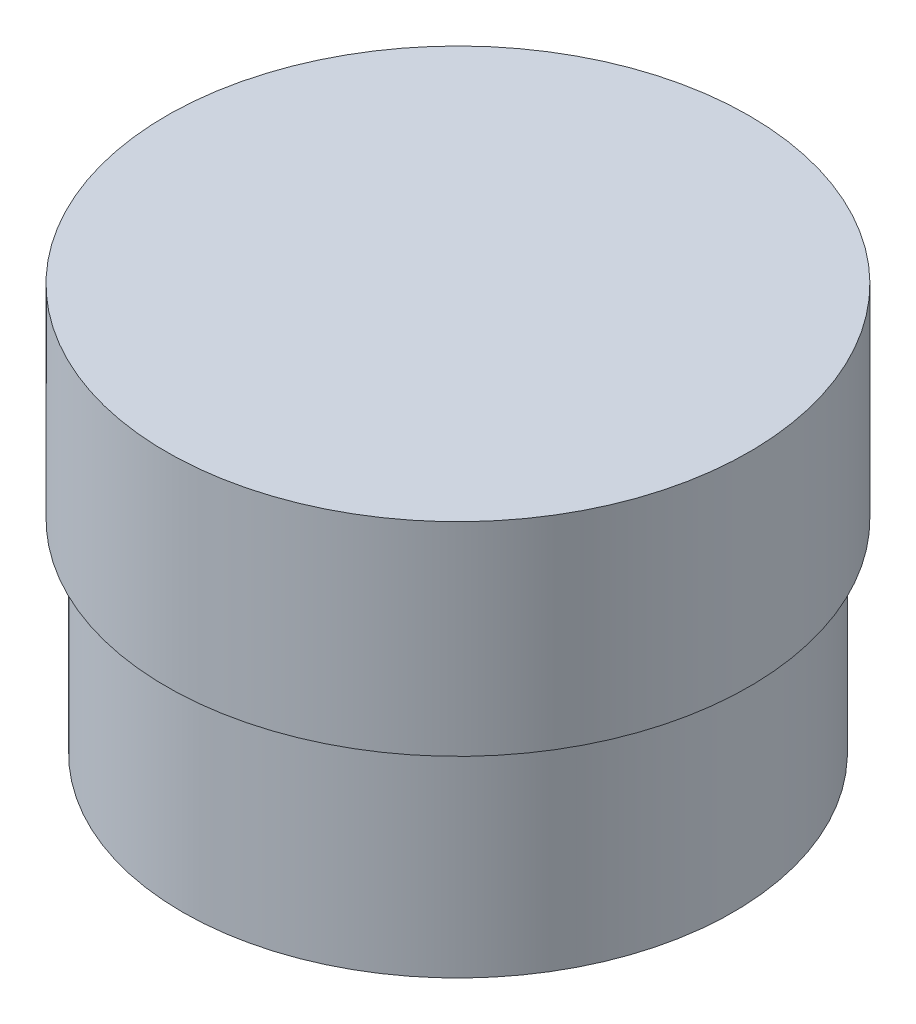
ISO-10303-21;
HEADER;
FILE_DESCRIPTION(('STEP AP214'),'2;1');
FILE_NAME('part.step','',(''),(''),'','','');
FILE_SCHEMA(('AUTOMOTIVE_DESIGN { 1 0 10303 214 1 1 1 1 }'));
ENDSEC;
DATA;
#1=APPLICATION_CONTEXT('core data for automotive mechanical design processes');
#2=APPLICATION_PROTOCOL_DEFINITION('international standard','automotive_design',2000,#1);
#3=PRODUCT_CONTEXT('',#1,'mechanical');
#4=PRODUCT('Part','Part','',(#3));
#5=PRODUCT_RELATED_PRODUCT_CATEGORY('part','',(#4));
#6=PRODUCT_DEFINITION_FORMATION('','',#4);
#7=PRODUCT_DEFINITION_CONTEXT('part definition',#1,'design');
#8=PRODUCT_DEFINITION('design','',#6,#7);
#9=PRODUCT_DEFINITION_SHAPE('','',#8);
#10=(LENGTH_UNIT() NAMED_UNIT(*) SI_UNIT(.MILLI.,.METRE.));
#11=(NAMED_UNIT(*) PLANE_ANGLE_UNIT() SI_UNIT($,.RADIAN.));
#12=(NAMED_UNIT(*) SI_UNIT($,.STERADIAN.) SOLID_ANGLE_UNIT());
#13=UNCERTAINTY_MEASURE_WITH_UNIT(LENGTH_MEASURE(1.E-05),#10,'distance_accuracy_value','');
#14=(GEOMETRIC_REPRESENTATION_CONTEXT(3) GLOBAL_UNCERTAINTY_ASSIGNED_CONTEXT((#13)) GLOBAL_UNIT_ASSIGNED_CONTEXT((#10,
#11,#12)) REPRESENTATION_CONTEXT('',''));
#15=CARTESIAN_POINT('',(0.,0.,0.));
#16=DIRECTION('',(0.,0.,1.));
#17=DIRECTION('',(1.,0.,0.));
#18=AXIS2_PLACEMENT_3D('',#15,#16,#17);
#19=CARTESIAN_POINT('',(0.,21.,0.));
#20=DIRECTION('',(0.,-1.,0.));
#21=DIRECTION('',(0.,0.,-1.));
#22=AXIS2_PLACEMENT_3D('',#19,#20,#21);
#23=CYLINDRICAL_SURFACE('',#22,30.1);
#24=CARTESIAN_POINT('',(0.,21.,0.));
#25=DIRECTION('',(0.,1.,0.));
#26=DIRECTION('',(0.,0.,1.));
#27=AXIS2_PLACEMENT_3D('',#24,#25,#26);
#28=CIRCLE('',#27,30.1);
#29=CARTESIAN_POINT('',(0.,21.,-30.1));
#30=VERTEX_POINT('',#29);
#31=EDGE_CURVE('E10',#30,#30,#28,.T.);
#32=CARTESIAN_POINT('',(0.,0.,0.));
#33=DIRECTION('',(0.,1.,0.));
#34=DIRECTION('',(0.,0.,1.));
#35=AXIS2_PLACEMENT_3D('',#32,#33,#34);
#36=CIRCLE('',#35,30.1);
#37=CARTESIAN_POINT('',(0.,0.,-30.1));
#38=VERTEX_POINT('',#37);
#39=EDGE_CURVE('E44',#38,#38,#36,.T.);
#40=CARTESIAN_POINT('',(0.,21.,-30.1));
#41=CARTESIAN_POINT('',(0.,20.78125,-30.1));
#42=CARTESIAN_POINT('',(0.,20.5625,-30.1));
#43=CARTESIAN_POINT('',(0.,20.125,-30.1));
#44=CARTESIAN_POINT('',(0.,19.90625,-30.1));
#45=CARTESIAN_POINT('',(0.,19.46875,-30.1));
#46=CARTESIAN_POINT('',(0.,19.25,-30.1));
#47=CARTESIAN_POINT('',(0.,18.8125,-30.1));
#48=CARTESIAN_POINT('',(0.,18.59375,-30.1));
#49=CARTESIAN_POINT('',(0.,18.15625,-30.1));
#50=CARTESIAN_POINT('',(0.,17.9375,-30.1));
#51=CARTESIAN_POINT('',(0.,17.5,-30.1));
#52=CARTESIAN_POINT('',(0.,17.28125,-30.1));
#53=CARTESIAN_POINT('',(0.,16.84375,-30.1));
#54=CARTESIAN_POINT('',(0.,16.625,-30.1));
#55=CARTESIAN_POINT('',(0.,16.1875,-30.1));
#56=CARTESIAN_POINT('',(0.,15.96875,-30.1));
#57=CARTESIAN_POINT('',(0.,15.53125,-30.1));
#58=CARTESIAN_POINT('',(0.,15.3125,-30.1));
#59=CARTESIAN_POINT('',(0.,14.875,-30.1));
#60=CARTESIAN_POINT('',(0.,14.65625,-30.1));
#61=CARTESIAN_POINT('',(0.,14.21875,-30.1));
#62=CARTESIAN_POINT('',(0.,14.,-30.1));
#63=CARTESIAN_POINT('',(0.,13.5625,-30.1));
#64=CARTESIAN_POINT('',(0.,13.34375,-30.1));
#65=CARTESIAN_POINT('',(0.,12.90625,-30.1));
#66=CARTESIAN_POINT('',(0.,12.6875,-30.1));
#67=CARTESIAN_POINT('',(0.,12.25,-30.1));
#68=CARTESIAN_POINT('',(0.,12.03125,-30.1));
#69=CARTESIAN_POINT('',(0.,11.59375,-30.1));
#70=CARTESIAN_POINT('',(0.,11.375,-30.1));
#71=CARTESIAN_POINT('',(0.,10.9375,-30.1));
#72=CARTESIAN_POINT('',(0.,10.71875,-30.1));
#73=CARTESIAN_POINT('',(0.,10.28125,-30.1));
#74=CARTESIAN_POINT('',(0.,10.0625,-30.1));
#75=CARTESIAN_POINT('',(0.,9.625,-30.1));
#76=CARTESIAN_POINT('',(0.,9.40625,-30.1));
#77=CARTESIAN_POINT('',(0.,8.96875,-30.1));
#78=CARTESIAN_POINT('',(0.,8.75,-30.1));
#79=CARTESIAN_POINT('',(0.,8.3125,-30.1));
#80=CARTESIAN_POINT('',(0.,8.09375,-30.1));
#81=CARTESIAN_POINT('',(0.,7.65625,-30.1));
#82=CARTESIAN_POINT('',(0.,7.4375,-30.1));
#83=CARTESIAN_POINT('',(0.,7.,-30.1));
#84=CARTESIAN_POINT('',(0.,6.78125,-30.1));
#85=CARTESIAN_POINT('',(0.,6.34375,-30.1));
#86=CARTESIAN_POINT('',(0.,6.125,-30.1));
#87=CARTESIAN_POINT('',(0.,5.6875,-30.1));
#88=CARTESIAN_POINT('',(0.,5.46875,-30.1));
#89=CARTESIAN_POINT('',(0.,5.03125,-30.1));
#90=CARTESIAN_POINT('',(0.,4.8125,-30.1));
#91=CARTESIAN_POINT('',(0.,4.375,-30.1));
#92=CARTESIAN_POINT('',(0.,4.15625,-30.1));
#93=CARTESIAN_POINT('',(0.,3.71875,-30.1));
#94=CARTESIAN_POINT('',(0.,3.5,-30.1));
#95=CARTESIAN_POINT('',(0.,3.0625,-30.1));
#96=CARTESIAN_POINT('',(0.,2.84375,-30.1));
#97=CARTESIAN_POINT('',(0.,2.40625,-30.1));
#98=CARTESIAN_POINT('',(0.,2.1875,-30.1));
#99=CARTESIAN_POINT('',(0.,1.75,-30.1));
#100=CARTESIAN_POINT('',(0.,1.53125,-30.1));
#101=CARTESIAN_POINT('',(0.,1.09375,-30.1));
#102=CARTESIAN_POINT('',(0.,0.875000000000001,-30.1));
#103=CARTESIAN_POINT('',(0.,0.4375,-30.1));
#104=CARTESIAN_POINT('',(0.,0.21875,-30.1));
#105=CARTESIAN_POINT('',(0.,0.,-30.1));
#106=B_SPLINE_CURVE_WITH_KNOTS('',3,(#40,#41,#42,#43,#44,#45,#46,#47,#48,#49,#50,#51,#52,#53,
#54,#55,#56,#57,#58,#59,#60,#61,#62,#63,#64,#65,#66,#67,#68,#69,#70,#71,#72,#73,#74,#75,#76,#77,
#78,#79,#80,#81,#82,#83,#84,#85,#86,#87,#88,#89,#90,#91,#92,#93,#94,#95,#96,#97,#98,#99,#100,
#101,#102,#103,#104,#105),.UNSPECIFIED.,.F.,.F.,(4,2,2,2,2,2,2,2,2,2,2,2,2,2,2,2,2,2,2,2,2,2,2,
2,2,2,2,2,2,2,2,2,4),(0.,0.656250000000001,1.3125,1.96875,2.625,3.28125,3.9375,4.59375,5.25,
5.90625,6.5625,7.21875,7.875,8.53125,9.1875,9.84375,10.5,11.15625,11.8125,12.46875,13.125,
13.78125,14.4375,15.09375,15.75,16.40625,17.0625,17.71875,18.375,19.03125,19.6875,20.34375,21.),.UNSPECIFIED.);
#107=EDGE_CURVE('BSEAM41',#30,#38,#106,.T.);
#108=ORIENTED_EDGE('',*,*,#31,.F.);
#109=ORIENTED_EDGE('',*,*,#39,.T.);
#110=ORIENTED_EDGE('',*,*,#107,.T.);
#111=ORIENTED_EDGE('',*,*,#107,.F.);
#112=EDGE_LOOP('',(#108,#110,#109,#111));
#113=FACE_BOUND('',#112,.T.);
#114=ADVANCED_FACE('F41',(#113),#23,.T.);
#115=CARTESIAN_POINT('',(0.,21.,0.));
#116=DIRECTION('',(0.,1.,0.));
#117=DIRECTION('',(0.,0.,1.));
#118=AXIS2_PLACEMENT_3D('',#115,#116,#117);
#119=PLANE('',#118);
#120=ORIENTED_EDGE('',*,*,#31,.T.);
#121=EDGE_LOOP('',(#120));
#122=FACE_BOUND('',#121,.T.);
#123=ADVANCED_FACE('F96',(#122),#119,.T.);
#124=CARTESIAN_POINT('',(0.,0.,0.));
#125=DIRECTION('',(0.,1.,0.));
#126=DIRECTION('',(0.,0.,1.));
#127=AXIS2_PLACEMENT_3D('',#124,#125,#126);
#128=PLANE('',#127);
#129=CARTESIAN_POINT('',(0.,0.,0.));
#130=DIRECTION('',(0.,1.,0.));
#131=DIRECTION('',(0.,0.,1.));
#132=AXIS2_PLACEMENT_3D('',#129,#130,#131);
#133=CIRCLE('',#132,28.45);
#134=CARTESIAN_POINT('',(0.,0.,28.45));
#135=VERTEX_POINT('',#134);
#136=EDGE_CURVE('E55',#135,#135,#133,.T.);
#137=ORIENTED_EDGE('',*,*,#136,.T.);
#138=EDGE_LOOP('',(#137));
#139=FACE_BOUND('',#138,.T.);
#140=ORIENTED_EDGE('',*,*,#39,.F.);
#141=EDGE_LOOP('',(#140));
#142=FACE_BOUND('',#141,.T.);
#143=ADVANCED_FACE('F101',(#139,#142),#128,.F.);
#144=CARTESIAN_POINT('',(0.,-21.,0.));
#145=DIRECTION('',(0.,1.,0.));
#146=DIRECTION('',(0.,0.,1.));
#147=AXIS2_PLACEMENT_3D('',#144,#145,#146);
#148=CYLINDRICAL_SURFACE('',#147,28.45);
#149=CARTESIAN_POINT('',(0.,-21.,0.));
#150=DIRECTION('',(0.,1.,0.));
#151=DIRECTION('',(0.,0.,1.));
#152=AXIS2_PLACEMENT_3D('',#149,#150,#151);
#153=CIRCLE('',#152,28.45);
#154=CARTESIAN_POINT('',(0.,-21.,28.45));
#155=VERTEX_POINT('',#154);
#156=EDGE_CURVE('E53',#155,#155,#153,.T.);
#157=CARTESIAN_POINT('',(0.,-21.,28.45));
#158=CARTESIAN_POINT('',(0.,-20.78125,28.45));
#159=CARTESIAN_POINT('',(0.,-20.5625,28.45));
#160=CARTESIAN_POINT('',(0.,-20.125,28.45));
#161=CARTESIAN_POINT('',(0.,-19.90625,28.45));
#162=CARTESIAN_POINT('',(0.,-19.46875,28.45));
#163=CARTESIAN_POINT('',(0.,-19.25,28.45));
#164=CARTESIAN_POINT('',(0.,-18.8125,28.45));
#165=CARTESIAN_POINT('',(0.,-18.59375,28.45));
#166=CARTESIAN_POINT('',(0.,-18.15625,28.45));
#167=CARTESIAN_POINT('',(0.,-17.9375,28.45));
#168=CARTESIAN_POINT('',(0.,-17.5,28.45));
#169=CARTESIAN_POINT('',(0.,-17.28125,28.45));
#170=CARTESIAN_POINT('',(0.,-16.84375,28.45));
#171=CARTESIAN_POINT('',(0.,-16.625,28.45));
#172=CARTESIAN_POINT('',(0.,-16.1875,28.45));
#173=CARTESIAN_POINT('',(0.,-15.96875,28.45));
#174=CARTESIAN_POINT('',(0.,-15.53125,28.45));
#175=CARTESIAN_POINT('',(0.,-15.3125,28.45));
#176=CARTESIAN_POINT('',(0.,-14.875,28.45));
#177=CARTESIAN_POINT('',(0.,-14.65625,28.45));
#178=CARTESIAN_POINT('',(0.,-14.21875,28.45));
#179=CARTESIAN_POINT('',(0.,-14.,28.45));
#180=CARTESIAN_POINT('',(0.,-13.5625,28.45));
#181=CARTESIAN_POINT('',(0.,-13.34375,28.45));
#182=CARTESIAN_POINT('',(0.,-12.90625,28.45));
#183=CARTESIAN_POINT('',(0.,-12.6875,28.45));
#184=CARTESIAN_POINT('',(0.,-12.25,28.45));
#185=CARTESIAN_POINT('',(0.,-12.03125,28.45));
#186=CARTESIAN_POINT('',(0.,-11.59375,28.45));
#187=CARTESIAN_POINT('',(0.,-11.375,28.45));
#188=CARTESIAN_POINT('',(0.,-10.9375,28.45));
#189=CARTESIAN_POINT('',(0.,-10.71875,28.45));
#190=CARTESIAN_POINT('',(0.,-10.28125,28.45));
#191=CARTESIAN_POINT('',(0.,-10.0625,28.45));
#192=CARTESIAN_POINT('',(0.,-9.625,28.45));
#193=CARTESIAN_POINT('',(0.,-9.40625,28.45));
#194=CARTESIAN_POINT('',(0.,-8.96875,28.45));
#195=CARTESIAN_POINT('',(0.,-8.75,28.45));
#196=CARTESIAN_POINT('',(0.,-8.3125,28.45));
#197=CARTESIAN_POINT('',(0.,-8.09375,28.45));
#198=CARTESIAN_POINT('',(0.,-7.65625,28.45));
#199=CARTESIAN_POINT('',(0.,-7.4375,28.45));
#200=CARTESIAN_POINT('',(0.,-7.,28.45));
#201=CARTESIAN_POINT('',(0.,-6.78125,28.45));
#202=CARTESIAN_POINT('',(0.,-6.34375,28.45));
#203=CARTESIAN_POINT('',(0.,-6.125,28.45));
#204=CARTESIAN_POINT('',(0.,-5.6875,28.45));
#205=CARTESIAN_POINT('',(0.,-5.46875,28.45));
#206=CARTESIAN_POINT('',(0.,-5.03125,28.45));
#207=CARTESIAN_POINT('',(0.,-4.8125,28.45));
#208=CARTESIAN_POINT('',(0.,-4.375,28.45));
#209=CARTESIAN_POINT('',(0.,-4.15625,28.45));
#210=CARTESIAN_POINT('',(0.,-3.71875,28.45));
#211=CARTESIAN_POINT('',(0.,-3.5,28.45));
#212=CARTESIAN_POINT('',(0.,-3.0625,28.45));
#213=CARTESIAN_POINT('',(0.,-2.84375,28.45));
#214=CARTESIAN_POINT('',(0.,-2.40625,28.45));
#215=CARTESIAN_POINT('',(0.,-2.1875,28.45));
#216=CARTESIAN_POINT('',(0.,-1.75,28.45));
#217=CARTESIAN_POINT('',(0.,-1.53125,28.45));
#218=CARTESIAN_POINT('',(0.,-1.09375,28.45));
#219=CARTESIAN_POINT('',(0.,-0.875000000000001,28.45));
#220=CARTESIAN_POINT('',(0.,-0.4375,28.45));
#221=CARTESIAN_POINT('',(0.,-0.21875,28.45));
#222=CARTESIAN_POINT('',(0.,0.,28.45));
#223=B_SPLINE_CURVE_WITH_KNOTS('',3,(#157,#158,#159,#160,#161,#162,#163,#164,#165,#166,#167,
#168,#169,#170,#171,#172,#173,#174,#175,#176,#177,#178,#179,#180,#181,#182,#183,#184,#185,#186,
#187,#188,#189,#190,#191,#192,#193,#194,#195,#196,#197,#198,#199,#200,#201,#202,#203,#204,#205,
#206,#207,#208,#209,#210,#211,#212,#213,#214,#215,#216,#217,#218,#219,#220,#221,#222),
.UNSPECIFIED.,.F.,.F.,(4,2,2,2,2,2,2,2,2,2,2,2,2,2,2,2,2,2,2,2,2,2,2,2,2,2,2,2,2,2,2,2,4),(0.,
0.656250000000001,1.3125,1.96875,2.625,3.28125,3.9375,4.59375,5.25,5.90625,6.5625,7.21875,7.875,
8.53125,9.1875,9.84375,10.5,11.15625,11.8125,12.46875,13.125,13.78125,14.4375,15.09375,15.75,
16.40625,17.0625,17.71875,18.375,19.03125,19.6875,20.34375,21.),.UNSPECIFIED.);
#224=EDGE_CURVE('BSEAM107',#155,#135,#223,.T.);
#225=ORIENTED_EDGE('',*,*,#156,.T.);
#226=ORIENTED_EDGE('',*,*,#136,.F.);
#227=ORIENTED_EDGE('',*,*,#224,.T.);
#228=ORIENTED_EDGE('',*,*,#224,.F.);
#229=EDGE_LOOP('',(#225,#227,#226,#228));
#230=FACE_BOUND('',#229,.T.);
#231=ADVANCED_FACE('F107',(#230),#148,.T.);
#232=CARTESIAN_POINT('',(0.,-21.,0.));
#233=DIRECTION('',(0.,1.,0.));
#234=DIRECTION('',(0.,0.,1.));
#235=AXIS2_PLACEMENT_3D('',#232,#233,#234);
#236=PLANE('',#235);
#237=CARTESIAN_POINT('',(0.,-21.,0.));
#238=DIRECTION('',(0.,1.,0.));
#239=DIRECTION('',(0.,0.,1.));
#240=AXIS2_PLACEMENT_3D('',#237,#238,#239);
#241=CIRCLE('',#240,27.45);
#242=CARTESIAN_POINT('',(0.,-21.,27.45));
#243=VERTEX_POINT('',#242);
#244=EDGE_CURVE('E63',#243,#243,#241,.T.);
#245=ORIENTED_EDGE('',*,*,#244,.T.);
#246=EDGE_LOOP('',(#245));
#247=FACE_BOUND('',#246,.T.);
#248=ORIENTED_EDGE('',*,*,#156,.F.);
#249=EDGE_LOOP('',(#248));
#250=FACE_BOUND('',#249,.T.);
#251=ADVANCED_FACE('F93',(#247,#250),#236,.F.);
#252=CARTESIAN_POINT('',(0.,21.,0.));
#253=DIRECTION('',(0.,-1.,0.));
#254=DIRECTION('',(0.,0.,-1.));
#255=AXIS2_PLACEMENT_3D('',#252,#253,#254);
#256=CYLINDRICAL_SURFACE('',#255,29.1);
#257=CARTESIAN_POINT('',(0.,20.,0.));
#258=DIRECTION('',(0.,1.,0.));
#259=DIRECTION('',(0.,0.,1.));
#260=AXIS2_PLACEMENT_3D('',#257,#258,#259);
#261=CIRCLE('',#260,29.1);
#262=CARTESIAN_POINT('',(0.,20.,-29.1));
#263=VERTEX_POINT('',#262);
#264=EDGE_CURVE('E59',#263,#263,#261,.T.);
#265=CARTESIAN_POINT('',(0.,1.,0.));
#266=DIRECTION('',(0.,1.,0.));
#267=DIRECTION('',(0.,0.,1.));
#268=AXIS2_PLACEMENT_3D('',#265,#266,#267);
#269=CIRCLE('',#268,29.1);
#270=CARTESIAN_POINT('',(0.,1.,-29.1));
#271=VERTEX_POINT('',#270);
#272=EDGE_CURVE('E67',#271,#271,#269,.T.);
#273=CARTESIAN_POINT('',(0.,20.,-29.1));
#274=CARTESIAN_POINT('',(0.,19.8020833333333,-29.1));
#275=CARTESIAN_POINT('',(0.,19.6041666666667,-29.1));
#276=CARTESIAN_POINT('',(0.,19.2083333333333,-29.1));
#277=CARTESIAN_POINT('',(0.,19.0104166666667,-29.1));
#278=CARTESIAN_POINT('',(0.,18.6145833333333,-29.1));
#279=CARTESIAN_POINT('',(0.,18.4166666666667,-29.1));
#280=CARTESIAN_POINT('',(0.,18.0208333333333,-29.1));
#281=CARTESIAN_POINT('',(0.,17.8229166666667,-29.1));
#282=CARTESIAN_POINT('',(0.,17.4270833333333,-29.1));
#283=CARTESIAN_POINT('',(0.,17.2291666666667,-29.1));
#284=CARTESIAN_POINT('',(0.,16.8333333333333,-29.1));
#285=CARTESIAN_POINT('',(0.,16.6354166666667,-29.1));
#286=CARTESIAN_POINT('',(0.,16.2395833333333,-29.1));
#287=CARTESIAN_POINT('',(0.,16.0416666666667,-29.1));
#288=CARTESIAN_POINT('',(0.,15.6458333333333,-29.1));
#289=CARTESIAN_POINT('',(0.,15.4479166666667,-29.1));
#290=CARTESIAN_POINT('',(0.,15.0520833333333,-29.1));
#291=CARTESIAN_POINT('',(0.,14.8541666666667,-29.1));
#292=CARTESIAN_POINT('',(0.,14.4583333333333,-29.1));
#293=CARTESIAN_POINT('',(0.,14.2604166666667,-29.1));
#294=CARTESIAN_POINT('',(0.,13.8645833333333,-29.1));
#295=CARTESIAN_POINT('',(0.,13.6666666666667,-29.1));
#296=CARTESIAN_POINT('',(0.,13.2708333333333,-29.1));
#297=CARTESIAN_POINT('',(0.,13.0729166666667,-29.1));
#298=CARTESIAN_POINT('',(0.,12.6770833333333,-29.1));
#299=CARTESIAN_POINT('',(0.,12.4791666666667,-29.1));
#300=CARTESIAN_POINT('',(0.,12.0833333333333,-29.1));
#301=CARTESIAN_POINT('',(0.,11.8854166666667,-29.1));
#302=CARTESIAN_POINT('',(0.,11.4895833333333,-29.1));
#303=CARTESIAN_POINT('',(0.,11.2916666666667,-29.1));
#304=CARTESIAN_POINT('',(0.,10.8958333333333,-29.1));
#305=CARTESIAN_POINT('',(0.,10.6979166666667,-29.1));
#306=CARTESIAN_POINT('',(0.,10.3020833333333,-29.1));
#307=CARTESIAN_POINT('',(0.,10.1041666666667,-29.1));
#308=CARTESIAN_POINT('',(0.,9.70833333333333,-29.1));
#309=CARTESIAN_POINT('',(0.,9.51041666666667,-29.1));
#310=CARTESIAN_POINT('',(0.,9.11458333333333,-29.1));
#311=CARTESIAN_POINT('',(0.,8.91666666666666,-29.1));
#312=CARTESIAN_POINT('',(0.,8.52083333333333,-29.1));
#313=CARTESIAN_POINT('',(0.,8.32291666666667,-29.1));
#314=CARTESIAN_POINT('',(0.,7.92708333333333,-29.1));
#315=CARTESIAN_POINT('',(0.,7.72916666666666,-29.1));
#316=CARTESIAN_POINT('',(0.,7.33333333333333,-29.1));
#317=CARTESIAN_POINT('',(0.,7.13541666666667,-29.1));
#318=CARTESIAN_POINT('',(0.,6.73958333333333,-29.1));
#319=CARTESIAN_POINT('',(0.,6.54166666666667,-29.1));
#320=CARTESIAN_POINT('',(0.,6.14583333333333,-29.1));
#321=CARTESIAN_POINT('',(0.,5.94791666666666,-29.1));
#322=CARTESIAN_POINT('',(0.,5.55208333333333,-29.1));
#323=CARTESIAN_POINT('',(0.,5.35416666666667,-29.1));
#324=CARTESIAN_POINT('',(0.,4.95833333333333,-29.1));
#325=CARTESIAN_POINT('',(0.,4.76041666666667,-29.1));
#326=CARTESIAN_POINT('',(0.,4.36458333333333,-29.1));
#327=CARTESIAN_POINT('',(0.,4.16666666666667,-29.1));
#328=CARTESIAN_POINT('',(0.,3.77083333333333,-29.1));
#329=CARTESIAN_POINT('',(0.,3.57291666666667,-29.1));
#330=CARTESIAN_POINT('',(0.,3.17708333333334,-29.1));
#331=CARTESIAN_POINT('',(0.,2.97916666666667,-29.1));
#332=CARTESIAN_POINT('',(0.,2.58333333333333,-29.1));
#333=CARTESIAN_POINT('',(0.,2.38541666666667,-29.1));
#334=CARTESIAN_POINT('',(0.,1.98958333333333,-29.1));
#335=CARTESIAN_POINT('',(0.,1.79166666666667,-29.1));
#336=CARTESIAN_POINT('',(0.,1.39583333333333,-29.1));
#337=CARTESIAN_POINT('',(0.,1.19791666666667,-29.1));
#338=CARTESIAN_POINT('',(0.,1.,-29.1));
#339=B_SPLINE_CURVE_WITH_KNOTS('',3,(#273,#274,#275,#276,#277,#278,#279,#280,#281,#282,#283,
#284,#285,#286,#287,#288,#289,#290,#291,#292,#293,#294,#295,#296,#297,#298,#299,#300,#301,#302,
#303,#304,#305,#306,#307,#308,#309,#310,#311,#312,#313,#314,#315,#316,#317,#318,#319,#320,#321,
#322,#323,#324,#325,#326,#327,#328,#329,#330,#331,#332,#333,#334,#335,#336,#337,#338),
.UNSPECIFIED.,.F.,.F.,(4,2,2,2,2,2,2,2,2,2,2,2,2,2,2,2,2,2,2,2,2,2,2,2,2,2,2,2,2,2,2,2,4),(0.,
0.593750000000001,1.1875,1.78125,2.375,2.96875,3.5625,4.15625,4.75,5.34375,5.9375,6.53125,7.125,
7.71875,8.3125,8.90625,9.5,10.09375,10.6875,11.28125,11.875,12.46875,13.0625,13.65625,14.25,
14.84375,15.4375,16.03125,16.625,17.21875,17.8125,18.40625,19.),.UNSPECIFIED.);
#340=EDGE_CURVE('BSEAM79',#263,#271,#339,.T.);
#341=ORIENTED_EDGE('',*,*,#264,.T.);
#342=ORIENTED_EDGE('',*,*,#272,.F.);
#343=ORIENTED_EDGE('',*,*,#340,.T.);
#344=ORIENTED_EDGE('',*,*,#340,.F.);
#345=EDGE_LOOP('',(#341,#343,#342,#344));
#346=FACE_BOUND('',#345,.T.);
#347=ADVANCED_FACE('F79',(#346),#256,.F.);
#348=CARTESIAN_POINT('',(0.,20.,0.));
#349=DIRECTION('',(0.,1.,0.));
#350=DIRECTION('',(0.,0.,1.));
#351=AXIS2_PLACEMENT_3D('',#348,#349,#350);
#352=PLANE('',#351);
#353=ORIENTED_EDGE('',*,*,#264,.F.);
#354=EDGE_LOOP('',(#353));
#355=FACE_BOUND('',#354,.T.);
#356=ADVANCED_FACE('F82',(#355),#352,.F.);
#357=CARTESIAN_POINT('',(0.,1.,0.));
#358=DIRECTION('',(0.,1.,0.));
#359=DIRECTION('',(0.,0.,1.));
#360=AXIS2_PLACEMENT_3D('',#357,#358,#359);
#361=PLANE('',#360);
#362=CARTESIAN_POINT('',(0.,1.,0.));
#363=DIRECTION('',(0.,1.,0.));
#364=DIRECTION('',(0.,0.,1.));
#365=AXIS2_PLACEMENT_3D('',#362,#363,#364);
#366=CIRCLE('',#365,27.45);
#367=CARTESIAN_POINT('',(0.,1.,27.45));
#368=VERTEX_POINT('',#367);
#369=EDGE_CURVE('E68',#368,#368,#366,.T.);
#370=ORIENTED_EDGE('',*,*,#369,.F.);
#371=EDGE_LOOP('',(#370));
#372=FACE_BOUND('',#371,.T.);
#373=ORIENTED_EDGE('',*,*,#272,.T.);
#374=EDGE_LOOP('',(#373));
#375=FACE_BOUND('',#374,.T.);
#376=ADVANCED_FACE('F84',(#372,#375),#361,.T.);
#377=CARTESIAN_POINT('',(0.,-21.,0.));
#378=DIRECTION('',(0.,1.,0.));
#379=DIRECTION('',(0.,0.,1.));
#380=AXIS2_PLACEMENT_3D('',#377,#378,#379);
#381=CYLINDRICAL_SURFACE('',#380,27.45);
#382=CARTESIAN_POINT('',(0.,-21.,27.45));
#383=CARTESIAN_POINT('',(0.,-20.7708333333333,27.45));
#384=CARTESIAN_POINT('',(0.,-20.5416666666667,27.45));
#385=CARTESIAN_POINT('',(0.,-20.0833333333333,27.45));
#386=CARTESIAN_POINT('',(0.,-19.8541666666667,27.45));
#387=CARTESIAN_POINT('',(0.,-19.3958333333333,27.45));
#388=CARTESIAN_POINT('',(0.,-19.1666666666667,27.45));
#389=CARTESIAN_POINT('',(0.,-18.7083333333333,27.45));
#390=CARTESIAN_POINT('',(0.,-18.4791666666667,27.45));
#391=CARTESIAN_POINT('',(0.,-18.0208333333333,27.45));
#392=CARTESIAN_POINT('',(0.,-17.7916666666667,27.45));
#393=CARTESIAN_POINT('',(0.,-17.3333333333333,27.45));
#394=CARTESIAN_POINT('',(0.,-17.1041666666667,27.45));
#395=CARTESIAN_POINT('',(0.,-16.6458333333333,27.45));
#396=CARTESIAN_POINT('',(0.,-16.4166666666667,27.45));
#397=CARTESIAN_POINT('',(0.,-15.9583333333333,27.45));
#398=CARTESIAN_POINT('',(0.,-15.7291666666667,27.45));
#399=CARTESIAN_POINT('',(0.,-15.2708333333333,27.45));
#400=CARTESIAN_POINT('',(0.,-15.0416666666667,27.45));
#401=CARTESIAN_POINT('',(0.,-14.5833333333333,27.45));
#402=CARTESIAN_POINT('',(0.,-14.3541666666667,27.45));
#403=CARTESIAN_POINT('',(0.,-13.8958333333333,27.45));
#404=CARTESIAN_POINT('',(0.,-13.6666666666667,27.45));
#405=CARTESIAN_POINT('',(0.,-13.2083333333333,27.45));
#406=CARTESIAN_POINT('',(0.,-12.9791666666667,27.45));
#407=CARTESIAN_POINT('',(0.,-12.5208333333333,27.45));
#408=CARTESIAN_POINT('',(0.,-12.2916666666667,27.45));
#409=CARTESIAN_POINT('',(0.,-11.8333333333333,27.45));
#410=CARTESIAN_POINT('',(0.,-11.6041666666667,27.45));
#411=CARTESIAN_POINT('',(0.,-11.1458333333333,27.45));
#412=CARTESIAN_POINT('',(0.,-10.9166666666667,27.45));
#413=CARTESIAN_POINT('',(0.,-10.4583333333333,27.45));
#414=CARTESIAN_POINT('',(0.,-10.2291666666667,27.45));
#415=CARTESIAN_POINT('',(0.,-9.77083333333333,27.45));
#416=CARTESIAN_POINT('',(0.,-9.54166666666667,27.45));
#417=CARTESIAN_POINT('',(0.,-9.08333333333333,27.45));
#418=CARTESIAN_POINT('',(0.,-8.85416666666667,27.45));
#419=CARTESIAN_POINT('',(0.,-8.39583333333334,27.45));
#420=CARTESIAN_POINT('',(0.,-8.16666666666667,27.45));
#421=CARTESIAN_POINT('',(0.,-7.70833333333334,27.45));
#422=CARTESIAN_POINT('',(0.,-7.47916666666667,27.45));
#423=CARTESIAN_POINT('',(0.,-7.02083333333333,27.45));
#424=CARTESIAN_POINT('',(0.,-6.79166666666667,27.45));
#425=CARTESIAN_POINT('',(0.,-6.33333333333333,27.45));
#426=CARTESIAN_POINT('',(0.,-6.10416666666667,27.45));
#427=CARTESIAN_POINT('',(0.,-5.64583333333333,27.45));
#428=CARTESIAN_POINT('',(0.,-5.41666666666667,27.45));
#429=CARTESIAN_POINT('',(0.,-4.95833333333333,27.45));
#430=CARTESIAN_POINT('',(0.,-4.72916666666667,27.45));
#431=CARTESIAN_POINT('',(0.,-4.27083333333333,27.45));
#432=CARTESIAN_POINT('',(0.,-4.04166666666667,27.45));
#433=CARTESIAN_POINT('',(0.,-3.58333333333333,27.45));
#434=CARTESIAN_POINT('',(0.,-3.35416666666667,27.45));
#435=CARTESIAN_POINT('',(0.,-2.89583333333333,27.45));
#436=CARTESIAN_POINT('',(0.,-2.66666666666667,27.45));
#437=CARTESIAN_POINT('',(0.,-2.20833333333333,27.45));
#438=CARTESIAN_POINT('',(0.,-1.97916666666667,27.45));
#439=CARTESIAN_POINT('',(0.,-1.52083333333333,27.45));
#440=CARTESIAN_POINT('',(0.,-1.29166666666667,27.45));
#441=CARTESIAN_POINT('',(0.,-0.833333333333334,27.45));
#442=CARTESIAN_POINT('',(0.,-0.604166666666667,27.45));
#443=CARTESIAN_POINT('',(0.,-0.145833333333333,27.45));
#444=CARTESIAN_POINT('',(0.,0.0833333333333335,27.45));
#445=CARTESIAN_POINT('',(0.,0.541666666666667,27.45));
#446=CARTESIAN_POINT('',(0.,0.770833333333334,27.45));
#447=CARTESIAN_POINT('',(0.,1.,27.45));
#448=B_SPLINE_CURVE_WITH_KNOTS('',3,(#382,#383,#384,#385,#386,#387,#388,#389,#390,#391,#392,
#393,#394,#395,#396,#397,#398,#399,#400,#401,#402,#403,#404,#405,#406,#407,#408,#409,#410,#411,
#412,#413,#414,#415,#416,#417,#418,#419,#420,#421,#422,#423,#424,#425,#426,#427,#428,#429,#430,
#431,#432,#433,#434,#435,#436,#437,#438,#439,#440,#441,#442,#443,#444,#445,#446,#447),
.UNSPECIFIED.,.F.,.F.,(4,2,2,2,2,2,2,2,2,2,2,2,2,2,2,2,2,2,2,2,2,2,2,2,2,2,2,2,2,2,2,2,4),(0.,
0.687499999999997,1.375,2.0625,2.75,3.4375,4.125,4.8125,5.5,6.1875,6.875,7.5625,8.25,8.9375,
9.625,10.3125,11.,11.6875,12.375,13.0625,13.75,14.4375,15.125,15.8125,16.5,17.1875,17.875,
18.5625,19.25,19.9375,20.625,21.3125,22.),.UNSPECIFIED.);
#449=EDGE_CURVE('BSEAM90',#243,#368,#448,.T.);
#450=ORIENTED_EDGE('',*,*,#244,.F.);
#451=ORIENTED_EDGE('',*,*,#369,.T.);
#452=ORIENTED_EDGE('',*,*,#449,.T.);
#453=ORIENTED_EDGE('',*,*,#449,.F.);
#454=EDGE_LOOP('',(#450,#452,#451,#453));
#455=FACE_BOUND('',#454,.T.);
#456=ADVANCED_FACE('F90',(#455),#381,.F.);
#457=CLOSED_SHELL('',(#114,#123,#143,#231,#251,#347,#356,#376,#456));
#458=MANIFOLD_SOLID_BREP('B2',#457);
#459=ADVANCED_BREP_SHAPE_REPRESENTATION('',(#18,#458),#14);
#460=SHAPE_DEFINITION_REPRESENTATION(#9,#459);
ENDSEC;
END-ISO-10303-21;
